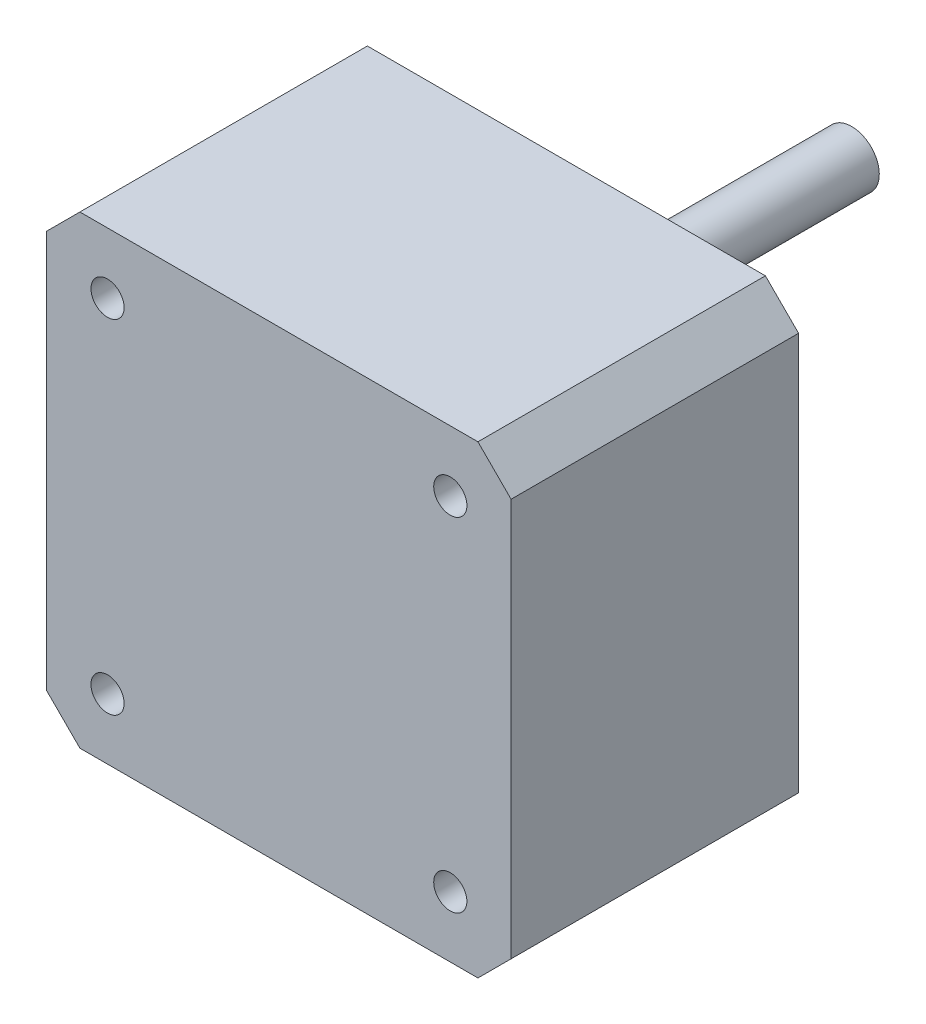
ISO-10303-21;
HEADER;
FILE_DESCRIPTION(('STEP AP214'),'2;1');
FILE_NAME('part.step','',(''),(''),'','','');
FILE_SCHEMA(('AUTOMOTIVE_DESIGN { 1 0 10303 214 1 1 1 1 }'));
ENDSEC;
DATA;
#1=APPLICATION_CONTEXT('core data for automotive mechanical design processes');
#2=APPLICATION_PROTOCOL_DEFINITION('international standard','automotive_design',2000,#1);
#3=PRODUCT_CONTEXT('',#1,'mechanical');
#4=PRODUCT('Part','Part','',(#3));
#5=PRODUCT_RELATED_PRODUCT_CATEGORY('part','',(#4));
#6=PRODUCT_DEFINITION_FORMATION('','',#4);
#7=PRODUCT_DEFINITION_CONTEXT('part definition',#1,'design');
#8=PRODUCT_DEFINITION('design','',#6,#7);
#9=PRODUCT_DEFINITION_SHAPE('','',#8);
#10=(LENGTH_UNIT() NAMED_UNIT(*) SI_UNIT(.MILLI.,.METRE.));
#11=(NAMED_UNIT(*) PLANE_ANGLE_UNIT() SI_UNIT($,.RADIAN.));
#12=(NAMED_UNIT(*) SI_UNIT($,.STERADIAN.) SOLID_ANGLE_UNIT());
#13=UNCERTAINTY_MEASURE_WITH_UNIT(LENGTH_MEASURE(1.E-05),#10,'distance_accuracy_value','');
#14=(GEOMETRIC_REPRESENTATION_CONTEXT(3) GLOBAL_UNCERTAINTY_ASSIGNED_CONTEXT((#13)) GLOBAL_UNIT_ASSIGNED_CONTEXT((#10,
#11,#12)) REPRESENTATION_CONTEXT('',''));
#15=CARTESIAN_POINT('',(0.,0.,0.));
#16=DIRECTION('',(0.,0.,1.));
#17=DIRECTION('',(1.,0.,0.));
#18=AXIS2_PLACEMENT_3D('',#15,#16,#17);
#19=CARTESIAN_POINT('',(0.,0.,0.5));
#20=DIRECTION('',(0.,0.,-1.));
#21=DIRECTION('',(-1.,0.,0.));
#22=AXIS2_PLACEMENT_3D('',#19,#20,#21);
#23=PLANE('',#22);
#24=CARTESIAN_POINT('',(0.,8.3,0.5));
#25=DIRECTION('',(0.,0.,-1.));
#26=DIRECTION('',(-1.,0.,0.));
#27=AXIS2_PLACEMENT_3D('',#24,#25,#26);
#28=CIRCLE('',#27,2.75);
#29=CARTESIAN_POINT('',(-2.75,8.3,0.5));
#30=VERTEX_POINT('',#29);
#31=EDGE_CURVE('E227',#30,#30,#28,.F.);
#32=ORIENTED_EDGE('',*,*,#31,.F.);
#33=EDGE_LOOP('',(#32));
#34=FACE_BOUND('',#33,.T.);
#35=DIRECTION('',(-1.,0.,0.));
#36=VECTOR('',#35,1.);
#37=CARTESIAN_POINT('',(1.68151717208002,6.45,0.5));
#38=LINE('',#37,#36);
#39=CARTESIAN_POINT('',(1.68151717208002,6.45,0.5));
#40=VERTEX_POINT('',#39);
#41=CARTESIAN_POINT('',(-1.68151717208002,6.45,0.5));
#42=VERTEX_POINT('',#41);
#43=EDGE_CURVE('E126',#40,#42,#38,.T.);
#44=ORIENTED_EDGE('',*,*,#43,.F.);
#45=CARTESIAN_POINT('',(0.,8.3,0.5));
#46=DIRECTION('',(0.,0.,-1.));
#47=DIRECTION('',(-1.,0.,0.));
#48=AXIS2_PLACEMENT_3D('',#45,#46,#47);
#49=CIRCLE('',#48,2.5);
#50=EDGE_CURVE('E50',#42,#40,#49,.T.);
#51=ORIENTED_EDGE('',*,*,#50,.F.);
#52=EDGE_LOOP('',(#44,#51));
#53=FACE_BOUND('',#52,.T.);
#54=ADVANCED_FACE('F35',(#34,#53),#23,.T.);
#55=CARTESIAN_POINT('',(-21.,21.,26.));
#56=DIRECTION('',(1.,0.,0.));
#57=DIRECTION('',(0.,1.,0.));
#58=AXIS2_PLACEMENT_3D('',#55,#56,#57);
#59=PLANE('',#58);
#60=DIRECTION('',(0.,-1.,0.));
#61=VECTOR('',#60,1.);
#62=CARTESIAN_POINT('',(-21.,21.,0.));
#63=LINE('',#62,#61);
#64=CARTESIAN_POINT('',(-21.,18.,0.));
#65=VERTEX_POINT('',#64);
#66=CARTESIAN_POINT('',(-21.,-18.,0.));
#67=VERTEX_POINT('',#66);
#68=EDGE_CURVE('E167',#65,#67,#63,.T.);
#69=ORIENTED_EDGE('',*,*,#68,.T.);
#70=DIRECTION('',(0.,0.,1.));
#71=VECTOR('',#70,1.);
#72=CARTESIAN_POINT('',(-21.,-18.,26.));
#73=LINE('',#72,#71);
#74=CARTESIAN_POINT('',(-21.,-18.,26.));
#75=VERTEX_POINT('',#74);
#76=EDGE_CURVE('E220',#67,#75,#73,.T.);
#77=ORIENTED_EDGE('',*,*,#76,.T.);
#78=DIRECTION('',(0.,-1.,0.));
#79=VECTOR('',#78,1.);
#80=CARTESIAN_POINT('',(-21.,21.,26.));
#81=LINE('',#80,#79);
#82=CARTESIAN_POINT('',(-21.,18.,26.));
#83=VERTEX_POINT('',#82);
#84=EDGE_CURVE('E170',#83,#75,#81,.T.);
#85=ORIENTED_EDGE('',*,*,#84,.F.);
#86=DIRECTION('',(0.,0.,-1.));
#87=VECTOR('',#86,1.);
#88=CARTESIAN_POINT('',(-21.,18.,0.));
#89=LINE('',#88,#87);
#90=EDGE_CURVE('E217',#83,#65,#89,.T.);
#91=ORIENTED_EDGE('',*,*,#90,.T.);
#92=EDGE_LOOP('',(#69,#77,#85,#91));
#93=FACE_BOUND('',#92,.T.);
#94=ADVANCED_FACE('F243',(#93),#59,.F.);
#95=CARTESIAN_POINT('',(-21.,-21.,26.));
#96=DIRECTION('',(0.,1.,0.));
#97=DIRECTION('',(0.,0.,1.));
#98=AXIS2_PLACEMENT_3D('',#95,#96,#97);
#99=PLANE('',#98);
#100=DIRECTION('',(1.,0.,0.));
#101=VECTOR('',#100,1.);
#102=CARTESIAN_POINT('',(-21.,-21.,0.));
#103=LINE('',#102,#101);
#104=CARTESIAN_POINT('',(-18.,-21.,0.));
#105=VERTEX_POINT('',#104);
#106=CARTESIAN_POINT('',(18.,-21.,0.));
#107=VERTEX_POINT('',#106);
#108=EDGE_CURVE('E185',#105,#107,#103,.T.);
#109=ORIENTED_EDGE('',*,*,#108,.T.);
#110=DIRECTION('',(0.,0.,1.));
#111=VECTOR('',#110,1.);
#112=CARTESIAN_POINT('',(18.,-21.,26.));
#113=LINE('',#112,#111);
#114=CARTESIAN_POINT('',(18.,-21.,26.));
#115=VERTEX_POINT('',#114);
#116=EDGE_CURVE('E208',#107,#115,#113,.T.);
#117=ORIENTED_EDGE('',*,*,#116,.T.);
#118=DIRECTION('',(1.,0.,0.));
#119=VECTOR('',#118,1.);
#120=CARTESIAN_POINT('',(-21.,-21.,26.));
#121=LINE('',#120,#119);
#122=CARTESIAN_POINT('',(-18.,-21.,26.));
#123=VERTEX_POINT('',#122);
#124=EDGE_CURVE('E173',#123,#115,#121,.T.);
#125=ORIENTED_EDGE('',*,*,#124,.F.);
#126=DIRECTION('',(0.,0.,-1.));
#127=VECTOR('',#126,1.);
#128=CARTESIAN_POINT('',(-18.,-21.,26.));
#129=LINE('',#128,#127);
#130=EDGE_CURVE('E205',#123,#105,#129,.T.);
#131=ORIENTED_EDGE('',*,*,#130,.T.);
#132=EDGE_LOOP('',(#109,#117,#125,#131));
#133=FACE_BOUND('',#132,.T.);
#134=ADVANCED_FACE('F250',(#133),#99,.F.);
#135=CARTESIAN_POINT('',(21.,21.,26.));
#136=DIRECTION('',(1.,0.,0.));
#137=DIRECTION('',(0.,1.,0.));
#138=AXIS2_PLACEMENT_3D('',#135,#136,#137);
#139=PLANE('',#138);
#140=DIRECTION('',(0.,-1.,0.));
#141=VECTOR('',#140,1.);
#142=CARTESIAN_POINT('',(21.,21.,26.));
#143=LINE('',#142,#141);
#144=CARTESIAN_POINT('',(21.,18.,26.));
#145=VERTEX_POINT('',#144);
#146=CARTESIAN_POINT('',(21.,-18.,26.));
#147=VERTEX_POINT('',#146);
#148=EDGE_CURVE('E177',#145,#147,#143,.T.);
#149=ORIENTED_EDGE('',*,*,#148,.T.);
#150=DIRECTION('',(0.,0.,-1.));
#151=VECTOR('',#150,1.);
#152=CARTESIAN_POINT('',(21.,-18.,0.));
#153=LINE('',#152,#151);
#154=CARTESIAN_POINT('',(21.,-18.,0.));
#155=VERTEX_POINT('',#154);
#156=EDGE_CURVE('E194',#147,#155,#153,.T.);
#157=ORIENTED_EDGE('',*,*,#156,.T.);
#158=DIRECTION('',(0.,-1.,0.));
#159=VECTOR('',#158,1.);
#160=CARTESIAN_POINT('',(21.,21.,0.));
#161=LINE('',#160,#159);
#162=CARTESIAN_POINT('',(21.,18.,0.));
#163=VERTEX_POINT('',#162);
#164=EDGE_CURVE('E188',#163,#155,#161,.T.);
#165=ORIENTED_EDGE('',*,*,#164,.F.);
#166=DIRECTION('',(0.,0.,1.));
#167=VECTOR('',#166,1.);
#168=CARTESIAN_POINT('',(21.,18.,26.));
#169=LINE('',#168,#167);
#170=EDGE_CURVE('E182',#163,#145,#169,.T.);
#171=ORIENTED_EDGE('',*,*,#170,.T.);
#172=EDGE_LOOP('',(#149,#157,#165,#171));
#173=FACE_BOUND('',#172,.T.);
#174=ADVANCED_FACE('F292',(#173),#139,.T.);
#175=CARTESIAN_POINT('',(-21.,21.,26.));
#176=DIRECTION('',(0.,1.,0.));
#177=DIRECTION('',(0.,0.,1.));
#178=AXIS2_PLACEMENT_3D('',#175,#176,#177);
#179=PLANE('',#178);
#180=DIRECTION('',(1.,0.,0.));
#181=VECTOR('',#180,1.);
#182=CARTESIAN_POINT('',(-21.,21.,0.));
#183=LINE('',#182,#181);
#184=CARTESIAN_POINT('',(-18.,21.,0.));
#185=VERTEX_POINT('',#184);
#186=CARTESIAN_POINT('',(18.,21.,0.));
#187=VERTEX_POINT('',#186);
#188=EDGE_CURVE('E174',#185,#187,#183,.T.);
#189=ORIENTED_EDGE('',*,*,#188,.F.);
#190=DIRECTION('',(0.,0.,1.));
#191=VECTOR('',#190,1.);
#192=CARTESIAN_POINT('',(-18.,21.,26.));
#193=LINE('',#192,#191);
#194=CARTESIAN_POINT('',(-18.,21.,26.));
#195=VERTEX_POINT('',#194);
#196=EDGE_CURVE('E225',#185,#195,#193,.T.);
#197=ORIENTED_EDGE('',*,*,#196,.T.);
#198=DIRECTION('',(1.,0.,0.));
#199=VECTOR('',#198,1.);
#200=CARTESIAN_POINT('',(-21.,21.,26.));
#201=LINE('',#200,#199);
#202=CARTESIAN_POINT('',(18.,21.,26.));
#203=VERTEX_POINT('',#202);
#204=EDGE_CURVE('E180',#195,#203,#201,.T.);
#205=ORIENTED_EDGE('',*,*,#204,.T.);
#206=DIRECTION('',(0.,0.,-1.));
#207=VECTOR('',#206,1.);
#208=CARTESIAN_POINT('',(18.,21.,26.));
#209=LINE('',#208,#207);
#210=EDGE_CURVE('E222',#203,#187,#209,.T.);
#211=ORIENTED_EDGE('',*,*,#210,.T.);
#212=EDGE_LOOP('',(#189,#197,#205,#211));
#213=FACE_BOUND('',#212,.T.);
#214=ADVANCED_FACE('F299',(#213),#179,.T.);
#215=CARTESIAN_POINT('',(0.,0.,26.));
#216=DIRECTION('',(0.,0.,1.));
#217=DIRECTION('',(1.,0.,0.));
#218=AXIS2_PLACEMENT_3D('',#215,#216,#217);
#219=PLANE('',#218);
#220=CARTESIAN_POINT('',(-15.5,-15.5,26.));
#221=DIRECTION('',(0.,0.,1.));
#222=DIRECTION('',(1.,0.,0.));
#223=AXIS2_PLACEMENT_3D('',#220,#221,#222);
#224=CIRCLE('',#223,1.5);
#225=CARTESIAN_POINT('',(-14.,-15.5,26.));
#226=VERTEX_POINT('',#225);
#227=EDGE_CURVE('E143',#226,#226,#224,.F.);
#228=ORIENTED_EDGE('',*,*,#227,.T.);
#229=EDGE_LOOP('',(#228));
#230=FACE_BOUND('',#229,.T.);
#231=CARTESIAN_POINT('',(15.5,-15.5,26.));
#232=DIRECTION('',(0.,0.,1.));
#233=DIRECTION('',(1.,0.,0.));
#234=AXIS2_PLACEMENT_3D('',#231,#232,#233);
#235=CIRCLE('',#234,1.5);
#236=CARTESIAN_POINT('',(17.,-15.5,26.));
#237=VERTEX_POINT('',#236);
#238=EDGE_CURVE('E149',#237,#237,#235,.F.);
#239=ORIENTED_EDGE('',*,*,#238,.T.);
#240=EDGE_LOOP('',(#239));
#241=FACE_BOUND('',#240,.T.);
#242=CARTESIAN_POINT('',(15.5,15.5,26.));
#243=DIRECTION('',(0.,0.,1.));
#244=DIRECTION('',(1.,0.,0.));
#245=AXIS2_PLACEMENT_3D('',#242,#243,#244);
#246=CIRCLE('',#245,1.5);
#247=CARTESIAN_POINT('',(17.,15.5,26.));
#248=VERTEX_POINT('',#247);
#249=EDGE_CURVE('E155',#248,#248,#246,.F.);
#250=ORIENTED_EDGE('',*,*,#249,.T.);
#251=EDGE_LOOP('',(#250));
#252=FACE_BOUND('',#251,.T.);
#253=CARTESIAN_POINT('',(-15.5,15.5,26.));
#254=DIRECTION('',(0.,0.,1.));
#255=DIRECTION('',(1.,0.,0.));
#256=AXIS2_PLACEMENT_3D('',#253,#254,#255);
#257=CIRCLE('',#256,1.5);
#258=CARTESIAN_POINT('',(-14.,15.5,26.));
#259=VERTEX_POINT('',#258);
#260=EDGE_CURVE('E161',#259,#259,#257,.F.);
#261=ORIENTED_EDGE('',*,*,#260,.T.);
#262=EDGE_LOOP('',(#261));
#263=FACE_BOUND('',#262,.T.);
#264=ORIENTED_EDGE('',*,*,#124,.T.);
#265=DIRECTION('',(0.707106781186549,0.707106781186546,0.));
#266=VECTOR('',#265,1.);
#267=CARTESIAN_POINT('',(19.5,-19.5,26.));
#268=LINE('',#267,#266);
#269=EDGE_CURVE('E215',#115,#147,#268,.T.);
#270=ORIENTED_EDGE('',*,*,#269,.T.);
#271=ORIENTED_EDGE('',*,*,#148,.F.);
#272=DIRECTION('',(0.707106781186547,-0.707106781186548,0.));
#273=VECTOR('',#272,1.);
#274=CARTESIAN_POINT('',(19.5,19.5,26.));
#275=LINE('',#274,#273);
#276=EDGE_CURVE('E58',#145,#203,#275,.F.);
#277=ORIENTED_EDGE('',*,*,#276,.T.);
#278=ORIENTED_EDGE('',*,*,#204,.F.);
#279=DIRECTION('',(-0.707106781186548,-0.707106781186547,0.));
#280=VECTOR('',#279,1.);
#281=CARTESIAN_POINT('',(-19.5,19.5,26.));
#282=LINE('',#281,#280);
#283=EDGE_CURVE('E211',#195,#83,#282,.T.);
#284=ORIENTED_EDGE('',*,*,#283,.T.);
#285=ORIENTED_EDGE('',*,*,#84,.T.);
#286=DIRECTION('',(-0.707106781186547,0.707106781186548,0.));
#287=VECTOR('',#286,1.);
#288=CARTESIAN_POINT('',(-19.5,-19.5,26.));
#289=LINE('',#288,#287);
#290=EDGE_CURVE('E213',#75,#123,#289,.F.);
#291=ORIENTED_EDGE('',*,*,#290,.T.);
#292=EDGE_LOOP('',(#264,#270,#271,#277,#278,#284,#285,#291));
#293=FACE_BOUND('',#292,.T.);
#294=ADVANCED_FACE('F278',(#230,#241,#252,#263,#293),#219,.T.);
#295=CARTESIAN_POINT('',(0.,0.,0.));
#296=DIRECTION('',(0.,0.,1.));
#297=DIRECTION('',(1.,0.,0.));
#298=AXIS2_PLACEMENT_3D('',#295,#296,#297);
#299=PLANE('',#298);
#300=CARTESIAN_POINT('',(0.,0.,0.));
#301=DIRECTION('',(0.,0.,-1.));
#302=DIRECTION('',(-1.,0.,0.));
#303=AXIS2_PLACEMENT_3D('',#300,#301,#302);
#304=CIRCLE('',#303,18.35);
#305=CARTESIAN_POINT('',(-18.35,0.,0.));
#306=VERTEX_POINT('',#305);
#307=EDGE_CURVE('E139',#306,#306,#304,.T.);
#308=ORIENTED_EDGE('',*,*,#307,.F.);
#309=EDGE_LOOP('',(#308));
#310=FACE_BOUND('',#309,.T.);
#311=CARTESIAN_POINT('',(-15.5,-15.5,0.));
#312=DIRECTION('',(0.,0.,-1.));
#313=DIRECTION('',(-1.,0.,0.));
#314=AXIS2_PLACEMENT_3D('',#311,#312,#313);
#315=CIRCLE('',#314,1.5);
#316=CARTESIAN_POINT('',(-17.,-15.5,0.));
#317=VERTEX_POINT('',#316);
#318=EDGE_CURVE('E146',#317,#317,#315,.T.);
#319=ORIENTED_EDGE('',*,*,#318,.F.);
#320=EDGE_LOOP('',(#319));
#321=FACE_BOUND('',#320,.T.);
#322=CARTESIAN_POINT('',(15.5,-15.5,0.));
#323=DIRECTION('',(0.,0.,-1.));
#324=DIRECTION('',(-1.,0.,0.));
#325=AXIS2_PLACEMENT_3D('',#322,#323,#324);
#326=CIRCLE('',#325,1.5);
#327=CARTESIAN_POINT('',(14.,-15.5,0.));
#328=VERTEX_POINT('',#327);
#329=EDGE_CURVE('E152',#328,#328,#326,.T.);
#330=ORIENTED_EDGE('',*,*,#329,.F.);
#331=EDGE_LOOP('',(#330));
#332=FACE_BOUND('',#331,.T.);
#333=CARTESIAN_POINT('',(15.5,15.5,0.));
#334=DIRECTION('',(0.,0.,-1.));
#335=DIRECTION('',(-1.,0.,0.));
#336=AXIS2_PLACEMENT_3D('',#333,#334,#335);
#337=CIRCLE('',#336,1.5);
#338=CARTESIAN_POINT('',(14.,15.5,0.));
#339=VERTEX_POINT('',#338);
#340=EDGE_CURVE('E158',#339,#339,#337,.T.);
#341=ORIENTED_EDGE('',*,*,#340,.F.);
#342=EDGE_LOOP('',(#341));
#343=FACE_BOUND('',#342,.T.);
#344=CARTESIAN_POINT('',(-15.5,15.5,0.));
#345=DIRECTION('',(0.,0.,-1.));
#346=DIRECTION('',(-1.,0.,0.));
#347=AXIS2_PLACEMENT_3D('',#344,#345,#346);
#348=CIRCLE('',#347,1.5);
#349=CARTESIAN_POINT('',(-17.,15.5,0.));
#350=VERTEX_POINT('',#349);
#351=EDGE_CURVE('E164',#350,#350,#348,.T.);
#352=ORIENTED_EDGE('',*,*,#351,.F.);
#353=EDGE_LOOP('',(#352));
#354=FACE_BOUND('',#353,.T.);
#355=ORIENTED_EDGE('',*,*,#164,.T.);
#356=DIRECTION('',(-0.707106781186549,-0.707106781186546,0.));
#357=VECTOR('',#356,1.);
#358=CARTESIAN_POINT('',(21.,-18.,0.));
#359=LINE('',#358,#357);
#360=EDGE_CURVE('E203',#155,#107,#359,.T.);
#361=ORIENTED_EDGE('',*,*,#360,.T.);
#362=ORIENTED_EDGE('',*,*,#108,.F.);
#363=DIRECTION('',(0.707106781186547,-0.707106781186548,0.));
#364=VECTOR('',#363,1.);
#365=CARTESIAN_POINT('',(-18.,-21.,0.));
#366=LINE('',#365,#364);
#367=EDGE_CURVE('E201',#105,#67,#366,.F.);
#368=ORIENTED_EDGE('',*,*,#367,.T.);
#369=ORIENTED_EDGE('',*,*,#68,.F.);
#370=DIRECTION('',(0.707106781186548,0.707106781186547,0.));
#371=VECTOR('',#370,1.);
#372=CARTESIAN_POINT('',(-21.,18.,0.));
#373=LINE('',#372,#371);
#374=EDGE_CURVE('E199',#65,#185,#373,.T.);
#375=ORIENTED_EDGE('',*,*,#374,.T.);
#376=ORIENTED_EDGE('',*,*,#188,.T.);
#377=DIRECTION('',(-0.707106781186547,0.707106781186548,0.));
#378=VECTOR('',#377,1.);
#379=CARTESIAN_POINT('',(18.,21.,0.));
#380=LINE('',#379,#378);
#381=EDGE_CURVE('E197',#187,#163,#380,.F.);
#382=ORIENTED_EDGE('',*,*,#381,.T.);
#383=EDGE_LOOP('',(#355,#361,#362,#368,#369,#375,#376,#382));
#384=FACE_BOUND('',#383,.T.);
#385=ADVANCED_FACE('F274',(#310,#321,#332,#343,#354,#384),#299,.F.);
#386=CARTESIAN_POINT('',(21.,-18.,26.));
#387=DIRECTION('',(0.707106781186546,-0.707106781186549,0.));
#388=DIRECTION('',(0.,0.,1.));
#389=AXIS2_PLACEMENT_3D('',#386,#387,#388);
#390=PLANE('',#389);
#391=ORIENTED_EDGE('',*,*,#269,.F.);
#392=ORIENTED_EDGE('',*,*,#116,.F.);
#393=ORIENTED_EDGE('',*,*,#360,.F.);
#394=ORIENTED_EDGE('',*,*,#156,.F.);
#395=EDGE_LOOP('',(#391,#392,#393,#394));
#396=FACE_BOUND('',#395,.T.);
#397=ADVANCED_FACE('F277',(#396),#390,.T.);
#398=CARTESIAN_POINT('',(-18.,-21.,26.));
#399=DIRECTION('',(0.707106781186548,0.707106781186547,0.));
#400=DIRECTION('',(0.,0.,-1.));
#401=AXIS2_PLACEMENT_3D('',#398,#399,#400);
#402=PLANE('',#401);
#403=ORIENTED_EDGE('',*,*,#290,.F.);
#404=ORIENTED_EDGE('',*,*,#76,.F.);
#405=ORIENTED_EDGE('',*,*,#367,.F.);
#406=ORIENTED_EDGE('',*,*,#130,.F.);
#407=EDGE_LOOP('',(#403,#404,#405,#406));
#408=FACE_BOUND('',#407,.T.);
#409=ADVANCED_FACE('F312',(#408),#402,.F.);
#410=CARTESIAN_POINT('',(-21.,18.,26.));
#411=DIRECTION('',(-0.707106781186547,0.707106781186548,0.));
#412=DIRECTION('',(0.,0.,1.));
#413=AXIS2_PLACEMENT_3D('',#410,#411,#412);
#414=PLANE('',#413);
#415=ORIENTED_EDGE('',*,*,#283,.F.);
#416=ORIENTED_EDGE('',*,*,#196,.F.);
#417=ORIENTED_EDGE('',*,*,#374,.F.);
#418=ORIENTED_EDGE('',*,*,#90,.F.);
#419=EDGE_LOOP('',(#415,#416,#417,#418));
#420=FACE_BOUND('',#419,.T.);
#421=ADVANCED_FACE('F305',(#420),#414,.T.);
#422=CARTESIAN_POINT('',(18.,21.,26.));
#423=DIRECTION('',(-0.707106781186548,-0.707106781186547,0.));
#424=DIRECTION('',(0.,0.,-1.));
#425=AXIS2_PLACEMENT_3D('',#422,#423,#424);
#426=PLANE('',#425);
#427=ORIENTED_EDGE('',*,*,#276,.F.);
#428=ORIENTED_EDGE('',*,*,#170,.F.);
#429=ORIENTED_EDGE('',*,*,#381,.F.);
#430=ORIENTED_EDGE('',*,*,#210,.F.);
#431=EDGE_LOOP('',(#427,#428,#429,#430));
#432=FACE_BOUND('',#431,.T.);
#433=ADVANCED_FACE('F295',(#432),#426,.F.);
#434=CARTESIAN_POINT('',(-15.5,15.5,26.001));
#435=DIRECTION('',(0.,0.,-1.));
#436=DIRECTION('',(-1.,0.,0.));
#437=AXIS2_PLACEMENT_3D('',#434,#435,#436);
#438=CYLINDRICAL_SURFACE('',#437,1.5);
#439=ORIENTED_EDGE('',*,*,#260,.F.);
#440=EDGE_LOOP('',(#439));
#441=FACE_BOUND('',#440,.T.);
#442=ORIENTED_EDGE('',*,*,#351,.T.);
#443=EDGE_LOOP('',(#442));
#444=FACE_BOUND('',#443,.T.);
#445=ADVANCED_FACE('F327',(#441,#444),#438,.F.);
#446=CARTESIAN_POINT('',(15.5,15.5,26.001));
#447=DIRECTION('',(0.,0.,-1.));
#448=DIRECTION('',(-1.,0.,0.));
#449=AXIS2_PLACEMENT_3D('',#446,#447,#448);
#450=CYLINDRICAL_SURFACE('',#449,1.5);
#451=ORIENTED_EDGE('',*,*,#249,.F.);
#452=EDGE_LOOP('',(#451));
#453=FACE_BOUND('',#452,.T.);
#454=ORIENTED_EDGE('',*,*,#340,.T.);
#455=EDGE_LOOP('',(#454));
#456=FACE_BOUND('',#455,.T.);
#457=ADVANCED_FACE('F331',(#453,#456),#450,.F.);
#458=CARTESIAN_POINT('',(15.5,-15.5,26.001));
#459=DIRECTION('',(0.,0.,-1.));
#460=DIRECTION('',(-1.,0.,0.));
#461=AXIS2_PLACEMENT_3D('',#458,#459,#460);
#462=CYLINDRICAL_SURFACE('',#461,1.5);
#463=ORIENTED_EDGE('',*,*,#238,.F.);
#464=EDGE_LOOP('',(#463));
#465=FACE_BOUND('',#464,.T.);
#466=ORIENTED_EDGE('',*,*,#329,.T.);
#467=EDGE_LOOP('',(#466));
#468=FACE_BOUND('',#467,.T.);
#469=ADVANCED_FACE('F337',(#465,#468),#462,.F.);
#470=CARTESIAN_POINT('',(-15.5,-15.5,26.001));
#471=DIRECTION('',(0.,0.,-1.));
#472=DIRECTION('',(-1.,0.,0.));
#473=AXIS2_PLACEMENT_3D('',#470,#471,#472);
#474=CYLINDRICAL_SURFACE('',#473,1.5);
#475=ORIENTED_EDGE('',*,*,#227,.F.);
#476=EDGE_LOOP('',(#475));
#477=FACE_BOUND('',#476,.T.);
#478=ORIENTED_EDGE('',*,*,#318,.T.);
#479=EDGE_LOOP('',(#478));
#480=FACE_BOUND('',#479,.T.);
#481=ADVANCED_FACE('F267',(#477,#480),#474,.F.);
#482=CARTESIAN_POINT('',(0.,0.,0.5));
#483=DIRECTION('',(0.,0.,-1.));
#484=DIRECTION('',(-1.,0.,0.));
#485=AXIS2_PLACEMENT_3D('',#482,#483,#484);
#486=CYLINDRICAL_SURFACE('',#485,18.35);
#487=CARTESIAN_POINT('',(0.,0.,0.5));
#488=DIRECTION('',(0.,0.,-1.));
#489=DIRECTION('',(-1.,0.,0.));
#490=AXIS2_PLACEMENT_3D('',#487,#488,#489);
#491=CIRCLE('',#490,18.35);
#492=CARTESIAN_POINT('',(-18.35,0.,0.5));
#493=VERTEX_POINT('',#492);
#494=EDGE_CURVE('E140',#493,#493,#491,.T.);
#495=ORIENTED_EDGE('',*,*,#494,.F.);
#496=EDGE_LOOP('',(#495));
#497=FACE_BOUND('',#496,.T.);
#498=ORIENTED_EDGE('',*,*,#307,.T.);
#499=EDGE_LOOP('',(#498));
#500=FACE_BOUND('',#499,.T.);
#501=ADVANCED_FACE('F259',(#497,#500),#486,.F.);
#502=CARTESIAN_POINT('',(0.,8.3,0.5));
#503=DIRECTION('',(0.,0.,-1.));
#504=DIRECTION('',(-1.,0.,0.));
#505=AXIS2_PLACEMENT_3D('',#502,#503,#504);
#506=CIRCLE('',#505,9.4);
#507=CARTESIAN_POINT('',(-9.4,8.3,0.5));
#508=VERTEX_POINT('',#507);
#509=EDGE_CURVE('E11',#508,#508,#506,.F.);
#510=ORIENTED_EDGE('',*,*,#509,.T.);
#511=EDGE_LOOP('',(#510));
#512=FACE_BOUND('',#511,.T.);
#513=ORIENTED_EDGE('',*,*,#494,.T.);
#514=EDGE_LOOP('',(#513));
#515=FACE_BOUND('',#514,.T.);
#516=ADVANCED_FACE('F246',(#512,#515),#23,.T.);
#517=CARTESIAN_POINT('',(0.,8.3,-3.));
#518=DIRECTION('',(0.,0.,-1.));
#519=DIRECTION('',(-1.,0.,0.));
#520=AXIS2_PLACEMENT_3D('',#517,#518,#519);
#521=PLANE('',#520);
#522=CARTESIAN_POINT('',(0.,8.3,-3.));
#523=DIRECTION('',(0.,0.,-1.));
#524=DIRECTION('',(-1.,0.,0.));
#525=AXIS2_PLACEMENT_3D('',#522,#523,#524);
#526=CIRCLE('',#525,8.9);
#527=CARTESIAN_POINT('',(-8.9,8.3,-3.));
#528=VERTEX_POINT('',#527);
#529=EDGE_CURVE('E132',#528,#528,#526,.T.);
#530=ORIENTED_EDGE('',*,*,#529,.T.);
#531=EDGE_LOOP('',(#530));
#532=FACE_BOUND('',#531,.T.);
#533=CARTESIAN_POINT('',(0.,8.3,-3.));
#534=DIRECTION('',(0.,0.,-1.));
#535=DIRECTION('',(-1.,0.,0.));
#536=AXIS2_PLACEMENT_3D('',#533,#534,#535);
#537=CIRCLE('',#536,2.75);
#538=CARTESIAN_POINT('',(-2.75,8.3,-3.));
#539=VERTEX_POINT('',#538);
#540=EDGE_CURVE('E129',#539,#539,#537,.T.);
#541=ORIENTED_EDGE('',*,*,#540,.F.);
#542=EDGE_LOOP('',(#541));
#543=FACE_BOUND('',#542,.T.);
#544=ADVANCED_FACE('F258',(#532,#543),#521,.T.);
#545=CARTESIAN_POINT('',(0.,8.3,-3.));
#546=DIRECTION('',(0.,0.,1.));
#547=DIRECTION('',(1.,0.,0.));
#548=AXIS2_PLACEMENT_3D('',#545,#546,#547);
#549=CYLINDRICAL_SURFACE('',#548,8.9);
#550=CARTESIAN_POINT('',(0.,8.3,0.));
#551=DIRECTION('',(0.,0.,-1.));
#552=DIRECTION('',(-1.,0.,0.));
#553=AXIS2_PLACEMENT_3D('',#550,#551,#552);
#554=CIRCLE('',#553,8.9);
#555=CARTESIAN_POINT('',(-8.9,8.3,0.));
#556=VERTEX_POINT('',#555);
#557=EDGE_CURVE('E43',#556,#556,#554,.T.);
#558=ORIENTED_EDGE('',*,*,#557,.T.);
#559=EDGE_LOOP('',(#558));
#560=FACE_BOUND('',#559,.T.);
#561=ORIENTED_EDGE('',*,*,#529,.F.);
#562=EDGE_LOOP('',(#561));
#563=FACE_BOUND('',#562,.T.);
#564=ADVANCED_FACE('F232',(#560,#563),#549,.T.);
#565=CARTESIAN_POINT('',(0.,8.3,-3.));
#566=DIRECTION('',(0.,0.,1.));
#567=DIRECTION('',(1.,0.,0.));
#568=AXIS2_PLACEMENT_3D('',#565,#566,#567);
#569=CYLINDRICAL_SURFACE('',#568,2.75);
#570=ORIENTED_EDGE('',*,*,#540,.T.);
#571=EDGE_LOOP('',(#570));
#572=FACE_BOUND('',#571,.T.);
#573=ORIENTED_EDGE('',*,*,#31,.T.);
#574=EDGE_LOOP('',(#573));
#575=FACE_BOUND('',#574,.T.);
#576=ADVANCED_FACE('F397',(#572,#575),#569,.F.);
#577=CARTESIAN_POINT('',(0.,8.3,-25.8));
#578=DIRECTION('',(0.,0.,1.));
#579=DIRECTION('',(1.,0.,0.));
#580=AXIS2_PLACEMENT_3D('',#577,#578,#579);
#581=CYLINDRICAL_SURFACE('',#580,2.5);
#582=ORIENTED_EDGE('',*,*,#50,.T.);
#583=DIRECTION('',(0.,0.,1.));
#584=VECTOR('',#583,1.);
#585=CARTESIAN_POINT('',(1.68151717208002,6.45,-25.8));
#586=LINE('',#585,#584);
#587=CARTESIAN_POINT('',(1.68151717208002,6.45,-25.8));
#588=VERTEX_POINT('',#587);
#589=EDGE_CURVE('E118',#588,#40,#586,.T.);
#590=ORIENTED_EDGE('',*,*,#589,.F.);
#591=CARTESIAN_POINT('',(0.,8.3,-25.8));
#592=DIRECTION('',(0.,0.,-1.));
#593=DIRECTION('',(-1.,0.,0.));
#594=AXIS2_PLACEMENT_3D('',#591,#592,#593);
#595=CIRCLE('',#594,2.5);
#596=CARTESIAN_POINT('',(-1.68151717208002,6.45,-25.8));
#597=VERTEX_POINT('',#596);
#598=EDGE_CURVE('E123',#597,#588,#595,.T.);
#599=ORIENTED_EDGE('',*,*,#598,.F.);
#600=DIRECTION('',(0.,0.,1.));
#601=VECTOR('',#600,1.);
#602=CARTESIAN_POINT('',(-1.68151717208002,6.45,-25.8));
#603=LINE('',#602,#601);
#604=EDGE_CURVE('E120',#597,#42,#603,.T.);
#605=ORIENTED_EDGE('',*,*,#604,.T.);
#606=EDGE_LOOP('',(#582,#590,#599,#605));
#607=FACE_BOUND('',#606,.T.);
#608=ADVANCED_FACE('F128',(#607),#581,.T.);
#609=CARTESIAN_POINT('',(1.68151717208002,6.45,-25.8));
#610=DIRECTION('',(0.,1.,0.));
#611=DIRECTION('',(0.,0.,1.));
#612=AXIS2_PLACEMENT_3D('',#609,#610,#611);
#613=PLANE('',#612);
#614=ORIENTED_EDGE('',*,*,#43,.T.);
#615=ORIENTED_EDGE('',*,*,#604,.F.);
#616=DIRECTION('',(-1.,0.,0.));
#617=VECTOR('',#616,1.);
#618=CARTESIAN_POINT('',(1.68151717208002,6.45,-25.8));
#619=LINE('',#618,#617);
#620=EDGE_CURVE('E115',#588,#597,#619,.T.);
#621=ORIENTED_EDGE('',*,*,#620,.F.);
#622=ORIENTED_EDGE('',*,*,#589,.T.);
#623=EDGE_LOOP('',(#614,#615,#621,#622));
#624=FACE_BOUND('',#623,.T.);
#625=ADVANCED_FACE('F117',(#624),#613,.F.);
#626=CARTESIAN_POINT('',(0.,8.3,-25.8));
#627=DIRECTION('',(0.,0.,-1.));
#628=DIRECTION('',(-1.,0.,0.));
#629=AXIS2_PLACEMENT_3D('',#626,#627,#628);
#630=PLANE('',#629);
#631=ORIENTED_EDGE('',*,*,#598,.T.);
#632=ORIENTED_EDGE('',*,*,#620,.T.);
#633=EDGE_LOOP('',(#631,#632));
#634=FACE_BOUND('',#633,.T.);
#635=ADVANCED_FACE('F125',(#634),#630,.T.);
#636=CARTESIAN_POINT('',(0.,8.3,0.));
#637=DIRECTION('',(0.,0.,-1.));
#638=DIRECTION('',(-1.,0.,0.));
#639=AXIS2_PLACEMENT_3D('',#636,#637,#638);
#640=TOROIDAL_SURFACE('',#639,9.4,0.5);
#641=ORIENTED_EDGE('',*,*,#509,.F.);
#642=EDGE_LOOP('',(#641));
#643=FACE_BOUND('',#642,.T.);
#644=ORIENTED_EDGE('',*,*,#557,.F.);
#645=EDGE_LOOP('',(#644));
#646=FACE_BOUND('',#645,.T.);
#647=ADVANCED_FACE('F37',(#643,#646),#640,.F.);
#648=CLOSED_SHELL('',(#54,#94,#134,#174,#214,#294,#385,#397,#409,#421,#433,#445,#457,#469,#481,
#501,#516,#544,#564,#576,#608,#625,#635,#647));
#649=MANIFOLD_SOLID_BREP('B2',#648);
#650=ADVANCED_BREP_SHAPE_REPRESENTATION('',(#18,#649),#14);
#651=SHAPE_DEFINITION_REPRESENTATION(#9,#650);
ENDSEC;
END-ISO-10303-21;
